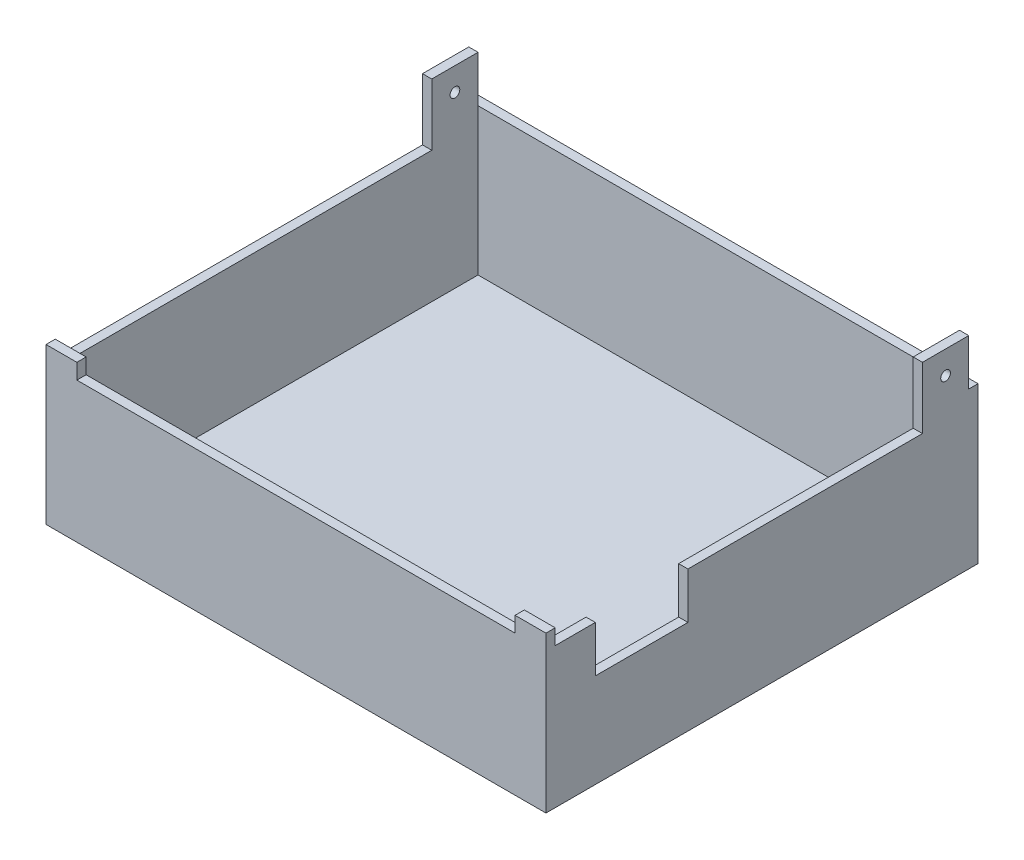
ISO-10303-21;
HEADER;
FILE_DESCRIPTION(('STEP AP214'),'2;1');
FILE_NAME('part.step','',(''),(''),'','','');
FILE_SCHEMA(('AUTOMOTIVE_DESIGN { 1 0 10303 214 1 1 1 1 }'));
ENDSEC;
DATA;
#1=APPLICATION_CONTEXT('core data for automotive mechanical design processes');
#2=APPLICATION_PROTOCOL_DEFINITION('international standard','automotive_design',2000,#1);
#3=PRODUCT_CONTEXT('',#1,'mechanical');
#4=PRODUCT('Part','Part','',(#3));
#5=PRODUCT_RELATED_PRODUCT_CATEGORY('part','',(#4));
#6=PRODUCT_DEFINITION_FORMATION('','',#4);
#7=PRODUCT_DEFINITION_CONTEXT('part definition',#1,'design');
#8=PRODUCT_DEFINITION('design','',#6,#7);
#9=PRODUCT_DEFINITION_SHAPE('','',#8);
#10=(LENGTH_UNIT() NAMED_UNIT(*) SI_UNIT(.MILLI.,.METRE.));
#11=(NAMED_UNIT(*) PLANE_ANGLE_UNIT() SI_UNIT($,.RADIAN.));
#12=(NAMED_UNIT(*) SI_UNIT($,.STERADIAN.) SOLID_ANGLE_UNIT());
#13=UNCERTAINTY_MEASURE_WITH_UNIT(LENGTH_MEASURE(1.E-05),#10,'distance_accuracy_value','');
#14=(GEOMETRIC_REPRESENTATION_CONTEXT(3) GLOBAL_UNCERTAINTY_ASSIGNED_CONTEXT((#13)) GLOBAL_UNIT_ASSIGNED_CONTEXT((#10,
#11,#12)) REPRESENTATION_CONTEXT('',''));
#15=CARTESIAN_POINT('',(0.,0.,0.));
#16=DIRECTION('',(0.,0.,1.));
#17=DIRECTION('',(1.,0.,0.));
#18=AXIS2_PLACEMENT_3D('',#15,#16,#17);
#19=CARTESIAN_POINT('',(-81.,45.5,-52.));
#20=DIRECTION('',(0.,-1.,0.));
#21=DIRECTION('',(0.,0.,-1.));
#22=AXIS2_PLACEMENT_3D('',#19,#20,#21);
#23=PLANE('',#22);
#24=DIRECTION('',(0.,0.,-1.));
#25=VECTOR('',#24,1.);
#26=CARTESIAN_POINT('',(81.,45.5,-52.));
#27=LINE('',#26,#25);
#28=CARTESIAN_POINT('',(81.,45.5,67.));
#29=VERTEX_POINT('',#28);
#30=CARTESIAN_POINT('',(81.,45.5,54.));
#31=VERTEX_POINT('',#30);
#32=EDGE_CURVE('E291',#29,#31,#27,.T.);
#33=ORIENTED_EDGE('',*,*,#32,.T.);
#34=DIRECTION('',(1.,0.,0.));
#35=VECTOR('',#34,1.);
#36=CARTESIAN_POINT('',(-81.001,45.5,54.));
#37=LINE('',#36,#35);
#38=CARTESIAN_POINT('',(78.,45.5,54.));
#39=VERTEX_POINT('',#38);
#40=EDGE_CURVE('E216',#39,#31,#37,.T.);
#41=ORIENTED_EDGE('',*,*,#40,.F.);
#42=DIRECTION('',(0.,0.,1.));
#43=VECTOR('',#42,1.);
#44=CARTESIAN_POINT('',(78.,45.5,-67.));
#45=LINE('',#44,#43);
#46=CARTESIAN_POINT('',(78.,45.5,67.));
#47=VERTEX_POINT('',#46);
#48=EDGE_CURVE('E339',#39,#47,#45,.T.);
#49=ORIENTED_EDGE('',*,*,#48,.T.);
#50=DIRECTION('',(1.,0.,0.));
#51=VECTOR('',#50,1.);
#52=CARTESIAN_POINT('',(-81.,45.5,67.));
#53=LINE('',#52,#51);
#54=EDGE_CURVE('E321',#47,#29,#53,.T.);
#55=ORIENTED_EDGE('',*,*,#54,.T.);
#56=EDGE_LOOP('',(#33,#41,#49,#55));
#57=FACE_BOUND('',#56,.T.);
#58=ADVANCED_FACE('F39',(#57),#23,.F.);
#59=CARTESIAN_POINT('',(0.,50.5,0.));
#60=DIRECTION('',(0.,1.,0.));
#61=DIRECTION('',(0.,0.,1.));
#62=AXIS2_PLACEMENT_3D('',#59,#60,#61);
#63=PLANE('',#62);
#64=DIRECTION('',(0.,0.,1.));
#65=VECTOR('',#64,1.);
#66=CARTESIAN_POINT('',(71.,50.5,-70.0010000000001));
#67=LINE('',#66,#65);
#68=CARTESIAN_POINT('',(71.,50.5,67.));
#69=VERTEX_POINT('',#68);
#70=CARTESIAN_POINT('',(71.,50.5,70.));
#71=VERTEX_POINT('',#70);
#72=EDGE_CURVE('E273',#69,#71,#67,.T.);
#73=ORIENTED_EDGE('',*,*,#72,.T.);
#74=DIRECTION('',(1.,0.,0.));
#75=VECTOR('',#74,1.);
#76=CARTESIAN_POINT('',(-80.9999999999999,50.5,70.));
#77=LINE('',#76,#75);
#78=CARTESIAN_POINT('',(81.,50.5,70.));
#79=VERTEX_POINT('',#78);
#80=EDGE_CURVE('E440',#71,#79,#77,.T.);
#81=ORIENTED_EDGE('',*,*,#80,.T.);
#82=DIRECTION('',(0.,0.,-1.));
#83=VECTOR('',#82,1.);
#84=CARTESIAN_POINT('',(81.,50.5,-70.0000000000001));
#85=LINE('',#84,#83);
#86=CARTESIAN_POINT('',(81.,50.5,67.));
#87=VERTEX_POINT('',#86);
#88=EDGE_CURVE('E428',#79,#87,#85,.T.);
#89=ORIENTED_EDGE('',*,*,#88,.T.);
#90=DIRECTION('',(1.,0.,0.));
#91=VECTOR('',#90,1.);
#92=CARTESIAN_POINT('',(-78.,50.5,67.));
#93=LINE('',#92,#91);
#94=EDGE_CURVE('E394',#69,#87,#93,.T.);
#95=ORIENTED_EDGE('',*,*,#94,.F.);
#96=EDGE_LOOP('',(#73,#81,#89,#95));
#97=FACE_BOUND('',#96,.T.);
#98=ADVANCED_FACE('F561',(#97),#63,.T.);
#99=DIRECTION('',(0.,0.,1.));
#100=VECTOR('',#99,1.);
#101=CARTESIAN_POINT('',(-71.,50.5,-70.0010000000001));
#102=LINE('',#101,#100);
#103=CARTESIAN_POINT('',(-71.,50.5,67.));
#104=VERTEX_POINT('',#103);
#105=CARTESIAN_POINT('',(-71.,50.5,70.));
#106=VERTEX_POINT('',#105);
#107=EDGE_CURVE('E269',#104,#106,#102,.T.);
#108=ORIENTED_EDGE('',*,*,#107,.F.);
#109=CARTESIAN_POINT('',(-81.,50.5,67.));
#110=VERTEX_POINT('',#109);
#111=EDGE_CURVE('E396',#110,#104,#93,.T.);
#112=ORIENTED_EDGE('',*,*,#111,.F.);
#113=DIRECTION('',(0.,0.,1.));
#114=VECTOR('',#113,1.);
#115=CARTESIAN_POINT('',(-80.9999999999999,50.5,-70.0000000000001));
#116=LINE('',#115,#114);
#117=CARTESIAN_POINT('',(-80.9999999999999,50.5,70.));
#118=VERTEX_POINT('',#117);
#119=EDGE_CURVE('E436',#110,#118,#116,.T.);
#120=ORIENTED_EDGE('',*,*,#119,.T.);
#121=EDGE_CURVE('E441',#118,#106,#77,.T.);
#122=ORIENTED_EDGE('',*,*,#121,.T.);
#123=EDGE_LOOP('',(#108,#112,#120,#122));
#124=FACE_BOUND('',#123,.T.);
#125=ADVANCED_FACE('F568',(#124),#63,.T.);
#126=DIRECTION('',(-1.,0.,0.));
#127=VECTOR('',#126,1.);
#128=CARTESIAN_POINT('',(-78.,50.5,-67.));
#129=LINE('',#128,#127);
#130=CARTESIAN_POINT('',(78.,50.5,-67.));
#131=VERTEX_POINT('',#130);
#132=CARTESIAN_POINT('',(-78.,50.5,-67.));
#133=VERTEX_POINT('',#132);
#134=EDGE_CURVE('E390',#131,#133,#129,.T.);
#135=ORIENTED_EDGE('',*,*,#134,.F.);
#136=DIRECTION('',(-1.,0.,0.));
#137=VECTOR('',#136,1.);
#138=CARTESIAN_POINT('',(78.,50.5,-67.));
#139=LINE('',#138,#137);
#140=CARTESIAN_POINT('',(81.,50.5,-67.));
#141=VERTEX_POINT('',#140);
#142=EDGE_CURVE('E347',#141,#131,#139,.T.);
#143=ORIENTED_EDGE('',*,*,#142,.F.);
#144=CARTESIAN_POINT('',(81.,50.5,-70.0000000000001));
#145=VERTEX_POINT('',#144);
#146=EDGE_CURVE('E427',#141,#145,#85,.T.);
#147=ORIENTED_EDGE('',*,*,#146,.T.);
#148=DIRECTION('',(-1.,0.,0.));
#149=VECTOR('',#148,1.);
#150=CARTESIAN_POINT('',(-80.9999999999999,50.5,-70.0000000000001));
#151=LINE('',#150,#149);
#152=CARTESIAN_POINT('',(-80.9999999999999,50.5,-70.0000000000001));
#153=VERTEX_POINT('',#152);
#154=EDGE_CURVE('E432',#145,#153,#151,.T.);
#155=ORIENTED_EDGE('',*,*,#154,.T.);
#156=CARTESIAN_POINT('',(-80.9999999999999,50.5,-67.));
#157=VERTEX_POINT('',#156);
#158=EDGE_CURVE('E437',#153,#157,#116,.T.);
#159=ORIENTED_EDGE('',*,*,#158,.T.);
#160=DIRECTION('',(-1.,0.,0.));
#161=VECTOR('',#160,1.);
#162=CARTESIAN_POINT('',(-78.,50.5,-67.));
#163=LINE('',#162,#161);
#164=EDGE_CURVE('E367',#133,#157,#163,.T.);
#165=ORIENTED_EDGE('',*,*,#164,.F.);
#166=EDGE_LOOP('',(#135,#143,#147,#155,#159,#165));
#167=FACE_BOUND('',#166,.T.);
#168=ADVANCED_FACE('F497',(#167),#63,.T.);
#169=CARTESIAN_POINT('',(-81.,3.,-70.));
#170=DIRECTION('',(1.,0.,0.));
#171=DIRECTION('',(0.,0.,-1.));
#172=AXIS2_PLACEMENT_3D('',#169,#170,#171);
#173=PLANE('',#172);
#174=CARTESIAN_POINT('',(-81.,58.,-59.5));
#175=DIRECTION('',(1.,0.,0.));
#176=DIRECTION('',(0.,0.,-1.));
#177=AXIS2_PLACEMENT_3D('',#174,#175,#176);
#178=CIRCLE('',#177,1.575);
#179=CARTESIAN_POINT('',(-81.,58.,-61.075));
#180=VERTEX_POINT('',#179);
#181=EDGE_CURVE('E304',#180,#180,#178,.T.);
#182=ORIENTED_EDGE('',*,*,#181,.T.);
#183=EDGE_LOOP('',(#182));
#184=FACE_BOUND('',#183,.T.);
#185=DIRECTION('',(0.,0.,-1.));
#186=VECTOR('',#185,1.);
#187=CARTESIAN_POINT('',(-81.,45.5,-52.));
#188=LINE('',#187,#186);
#189=CARTESIAN_POINT('',(-81.,45.5,67.));
#190=VERTEX_POINT('',#189);
#191=CARTESIAN_POINT('',(-81.,45.5,-52.));
#192=VERTEX_POINT('',#191);
#193=EDGE_CURVE('E295',#190,#192,#188,.T.);
#194=ORIENTED_EDGE('',*,*,#193,.T.);
#195=DIRECTION('',(0.,1.,0.));
#196=VECTOR('',#195,1.);
#197=CARTESIAN_POINT('',(-81.,65.5,-52.));
#198=LINE('',#197,#196);
#199=CARTESIAN_POINT('',(-81.,65.5,-52.));
#200=VERTEX_POINT('',#199);
#201=EDGE_CURVE('E286',#192,#200,#198,.T.);
#202=ORIENTED_EDGE('',*,*,#201,.T.);
#203=DIRECTION('',(0.,0.,1.));
#204=VECTOR('',#203,1.);
#205=CARTESIAN_POINT('',(-80.9999999999999,65.5,-67.));
#206=LINE('',#205,#204);
#207=CARTESIAN_POINT('',(-80.9999999999999,65.5,-67.));
#208=VERTEX_POINT('',#207);
#209=EDGE_CURVE('E374',#208,#200,#206,.T.);
#210=ORIENTED_EDGE('',*,*,#209,.F.);
#211=DIRECTION('',(0.,-1.,0.));
#212=VECTOR('',#211,1.);
#213=CARTESIAN_POINT('',(-80.9999999999999,65.5,-67.));
#214=LINE('',#213,#212);
#215=EDGE_CURVE('E378',#208,#157,#214,.T.);
#216=ORIENTED_EDGE('',*,*,#215,.T.);
#217=ORIENTED_EDGE('',*,*,#158,.F.);
#218=DIRECTION('',(0.,-1.,0.));
#219=VECTOR('',#218,1.);
#220=CARTESIAN_POINT('',(-81.,3.,-70.));
#221=LINE('',#220,#219);
#222=CARTESIAN_POINT('',(-81.,0.,-70.));
#223=VERTEX_POINT('',#222);
#224=EDGE_CURVE('E458',#153,#223,#221,.T.);
#225=ORIENTED_EDGE('',*,*,#224,.T.);
#226=DIRECTION('',(0.,0.,1.));
#227=VECTOR('',#226,1.);
#228=CARTESIAN_POINT('',(-81.,0.,-70.));
#229=LINE('',#228,#227);
#230=CARTESIAN_POINT('',(-81.,0.,70.));
#231=VERTEX_POINT('',#230);
#232=EDGE_CURVE('E445',#223,#231,#229,.T.);
#233=ORIENTED_EDGE('',*,*,#232,.T.);
#234=DIRECTION('',(0.,-1.,0.));
#235=VECTOR('',#234,1.);
#236=CARTESIAN_POINT('',(-81.,3.,70.));
#237=LINE('',#236,#235);
#238=EDGE_CURVE('E49',#118,#231,#237,.T.);
#239=ORIENTED_EDGE('',*,*,#238,.F.);
#240=ORIENTED_EDGE('',*,*,#119,.F.);
#241=DIRECTION('',(0.,-1.,0.));
#242=VECTOR('',#241,1.);
#243=CARTESIAN_POINT('',(-81.,65.5,67.));
#244=LINE('',#243,#242);
#245=EDGE_CURVE('E290',#110,#190,#244,.T.);
#246=ORIENTED_EDGE('',*,*,#245,.T.);
#247=EDGE_LOOP('',(#194,#202,#210,#216,#217,#225,#233,#239,#240,#246));
#248=FACE_BOUND('',#247,.T.);
#249=ADVANCED_FACE('F41',(#184,#248),#173,.F.);
#250=CARTESIAN_POINT('',(81.,3.,70.));
#251=DIRECTION('',(0.,0.,-1.));
#252=DIRECTION('',(-1.,0.,0.));
#253=AXIS2_PLACEMENT_3D('',#250,#251,#252);
#254=PLANE('',#253);
#255=ORIENTED_EDGE('',*,*,#80,.F.);
#256=DIRECTION('',(0.,1.,0.));
#257=VECTOR('',#256,1.);
#258=CARTESIAN_POINT('',(71.,50.5,70.));
#259=LINE('',#258,#257);
#260=CARTESIAN_POINT('',(71.,45.5,70.));
#261=VERTEX_POINT('',#260);
#262=EDGE_CURVE('E266',#261,#71,#259,.T.);
#263=ORIENTED_EDGE('',*,*,#262,.F.);
#264=DIRECTION('',(1.,0.,0.));
#265=VECTOR('',#264,1.);
#266=CARTESIAN_POINT('',(-71.,45.5,70.));
#267=LINE('',#266,#265);
#268=CARTESIAN_POINT('',(-71.,45.5,70.));
#269=VERTEX_POINT('',#268);
#270=EDGE_CURVE('E262',#269,#261,#267,.T.);
#271=ORIENTED_EDGE('',*,*,#270,.F.);
#272=DIRECTION('',(0.,-1.,0.));
#273=VECTOR('',#272,1.);
#274=CARTESIAN_POINT('',(-71.,50.5,70.));
#275=LINE('',#274,#273);
#276=EDGE_CURVE('E259',#106,#269,#275,.T.);
#277=ORIENTED_EDGE('',*,*,#276,.F.);
#278=ORIENTED_EDGE('',*,*,#121,.F.);
#279=ORIENTED_EDGE('',*,*,#238,.T.);
#280=DIRECTION('',(1.,0.,0.));
#281=VECTOR('',#280,1.);
#282=CARTESIAN_POINT('',(81.,0.,70.));
#283=LINE('',#282,#281);
#284=CARTESIAN_POINT('',(81.,0.,70.));
#285=VERTEX_POINT('',#284);
#286=EDGE_CURVE('E449',#231,#285,#283,.T.);
#287=ORIENTED_EDGE('',*,*,#286,.T.);
#288=DIRECTION('',(0.,-1.,0.));
#289=VECTOR('',#288,1.);
#290=CARTESIAN_POINT('',(81.,3.,70.));
#291=LINE('',#290,#289);
#292=EDGE_CURVE('E466',#79,#285,#291,.T.);
#293=ORIENTED_EDGE('',*,*,#292,.F.);
#294=EDGE_LOOP('',(#255,#263,#271,#277,#278,#279,#287,#293));
#295=FACE_BOUND('',#294,.T.);
#296=ADVANCED_FACE('F476',(#295),#254,.F.);
#297=CARTESIAN_POINT('',(81.,3.,-70.));
#298=DIRECTION('',(-1.,0.,0.));
#299=DIRECTION('',(0.,0.,1.));
#300=AXIS2_PLACEMENT_3D('',#297,#298,#299);
#301=PLANE('',#300);
#302=CARTESIAN_POINT('',(81.,58.,-59.5));
#303=DIRECTION('',(1.,0.,0.));
#304=DIRECTION('',(0.,0.,-1.));
#305=AXIS2_PLACEMENT_3D('',#302,#303,#304);
#306=CIRCLE('',#305,1.575);
#307=CARTESIAN_POINT('',(81.,58.,-61.075));
#308=VERTEX_POINT('',#307);
#309=EDGE_CURVE('E285',#308,#308,#306,.T.);
#310=ORIENTED_EDGE('',*,*,#309,.F.);
#311=EDGE_LOOP('',(#310));
#312=FACE_BOUND('',#311,.T.);
#313=DIRECTION('',(0.,0.,-1.));
#314=VECTOR('',#313,1.);
#315=CARTESIAN_POINT('',(81.,30.5,54.));
#316=LINE('',#315,#314);
#317=CARTESIAN_POINT('',(81.,30.5,54.));
#318=VERTEX_POINT('',#317);
#319=CARTESIAN_POINT('',(81.,30.5,24.));
#320=VERTEX_POINT('',#319);
#321=EDGE_CURVE('E223',#318,#320,#316,.T.);
#322=ORIENTED_EDGE('',*,*,#321,.F.);
#323=DIRECTION('',(0.,-1.,0.));
#324=VECTOR('',#323,1.);
#325=CARTESIAN_POINT('',(81.,45.5,54.));
#326=LINE('',#325,#324);
#327=EDGE_CURVE('E225',#31,#318,#326,.T.);
#328=ORIENTED_EDGE('',*,*,#327,.F.);
#329=ORIENTED_EDGE('',*,*,#32,.F.);
#330=DIRECTION('',(0.,-1.,0.));
#331=VECTOR('',#330,1.);
#332=CARTESIAN_POINT('',(81.,65.5,67.));
#333=LINE('',#332,#331);
#334=EDGE_CURVE('E303',#87,#29,#333,.T.);
#335=ORIENTED_EDGE('',*,*,#334,.F.);
#336=ORIENTED_EDGE('',*,*,#88,.F.);
#337=ORIENTED_EDGE('',*,*,#292,.T.);
#338=DIRECTION('',(0.,0.,-1.));
#339=VECTOR('',#338,1.);
#340=CARTESIAN_POINT('',(81.,0.,-70.));
#341=LINE('',#340,#339);
#342=CARTESIAN_POINT('',(81.,0.,-70.));
#343=VERTEX_POINT('',#342);
#344=EDGE_CURVE('E452',#285,#343,#341,.T.);
#345=ORIENTED_EDGE('',*,*,#344,.T.);
#346=DIRECTION('',(0.,-1.,0.));
#347=VECTOR('',#346,1.);
#348=CARTESIAN_POINT('',(81.,3.,-70.));
#349=LINE('',#348,#347);
#350=EDGE_CURVE('E462',#145,#343,#349,.T.);
#351=ORIENTED_EDGE('',*,*,#350,.F.);
#352=ORIENTED_EDGE('',*,*,#146,.F.);
#353=DIRECTION('',(0.,-1.,0.));
#354=VECTOR('',#353,1.);
#355=CARTESIAN_POINT('',(81.,65.5,-67.));
#356=LINE('',#355,#354);
#357=CARTESIAN_POINT('',(81.,65.5,-67.));
#358=VERTEX_POINT('',#357);
#359=EDGE_CURVE('E364',#358,#141,#356,.T.);
#360=ORIENTED_EDGE('',*,*,#359,.F.);
#361=DIRECTION('',(0.,0.,-1.));
#362=VECTOR('',#361,1.);
#363=CARTESIAN_POINT('',(81.,65.5,-67.));
#364=LINE('',#363,#362);
#365=CARTESIAN_POINT('',(81.,65.5,-52.));
#366=VERTEX_POINT('',#365);
#367=EDGE_CURVE('E352',#366,#358,#364,.T.);
#368=ORIENTED_EDGE('',*,*,#367,.F.);
#369=DIRECTION('',(0.,1.,0.));
#370=VECTOR('',#369,1.);
#371=CARTESIAN_POINT('',(81.,65.5,-52.));
#372=LINE('',#371,#370);
#373=CARTESIAN_POINT('',(81.,45.5,-52.));
#374=VERTEX_POINT('',#373);
#375=EDGE_CURVE('E300',#374,#366,#372,.T.);
#376=ORIENTED_EDGE('',*,*,#375,.F.);
#377=CARTESIAN_POINT('',(81.,45.5,24.));
#378=VERTEX_POINT('',#377);
#379=EDGE_CURVE('E308',#378,#374,#27,.T.);
#380=ORIENTED_EDGE('',*,*,#379,.F.);
#381=DIRECTION('',(0.,1.,0.));
#382=VECTOR('',#381,1.);
#383=CARTESIAN_POINT('',(81.,45.5,24.));
#384=LINE('',#383,#382);
#385=EDGE_CURVE('E56',#320,#378,#384,.T.);
#386=ORIENTED_EDGE('',*,*,#385,.F.);
#387=EDGE_LOOP('',(#322,#328,#329,#335,#336,#337,#345,#351,#352,#360,#368,#376,#380,#386));
#388=FACE_BOUND('',#387,.T.);
#389=ADVANCED_FACE('F489',(#312,#388),#301,.F.);
#390=CARTESIAN_POINT('',(81.,3.,-70.));
#391=DIRECTION('',(0.,0.,1.));
#392=DIRECTION('',(1.,0.,0.));
#393=AXIS2_PLACEMENT_3D('',#390,#391,#392);
#394=PLANE('',#393);
#395=DIRECTION('',(-1.,0.,0.));
#396=VECTOR('',#395,1.);
#397=CARTESIAN_POINT('',(81.,0.,-70.));
#398=LINE('',#397,#396);
#399=EDGE_CURVE('E455',#343,#223,#398,.T.);
#400=ORIENTED_EDGE('',*,*,#399,.T.);
#401=ORIENTED_EDGE('',*,*,#224,.F.);
#402=ORIENTED_EDGE('',*,*,#154,.F.);
#403=ORIENTED_EDGE('',*,*,#350,.T.);
#404=EDGE_LOOP('',(#400,#401,#402,#403));
#405=FACE_BOUND('',#404,.T.);
#406=ADVANCED_FACE('F494',(#405),#394,.F.);
#407=CARTESIAN_POINT('',(0.,0.,0.));
#408=DIRECTION('',(0.,-1.,0.));
#409=DIRECTION('',(0.,0.,-1.));
#410=AXIS2_PLACEMENT_3D('',#407,#408,#409);
#411=PLANE('',#410);
#412=ORIENTED_EDGE('',*,*,#232,.F.);
#413=ORIENTED_EDGE('',*,*,#399,.F.);
#414=ORIENTED_EDGE('',*,*,#344,.F.);
#415=ORIENTED_EDGE('',*,*,#286,.F.);
#416=EDGE_LOOP('',(#412,#413,#414,#415));
#417=FACE_BOUND('',#416,.T.);
#418=ADVANCED_FACE('F485',(#417),#411,.T.);
#419=CARTESIAN_POINT('',(78.,50.5,-67.));
#420=DIRECTION('',(-1.,0.,0.));
#421=DIRECTION('',(0.,0.,1.));
#422=AXIS2_PLACEMENT_3D('',#419,#420,#421);
#423=PLANE('',#422);
#424=DIRECTION('',(0.,-1.,0.));
#425=VECTOR('',#424,1.);
#426=CARTESIAN_POINT('',(78.,45.5,54.));
#427=LINE('',#426,#425);
#428=CARTESIAN_POINT('',(78.,30.5,54.));
#429=VERTEX_POINT('',#428);
#430=EDGE_CURVE('E231',#39,#429,#427,.T.);
#431=ORIENTED_EDGE('',*,*,#430,.T.);
#432=DIRECTION('',(0.,0.,-1.));
#433=VECTOR('',#432,1.);
#434=CARTESIAN_POINT('',(78.,30.5,54.));
#435=LINE('',#434,#433);
#436=CARTESIAN_POINT('',(78.,30.5,24.));
#437=VERTEX_POINT('',#436);
#438=EDGE_CURVE('E220',#429,#437,#435,.T.);
#439=ORIENTED_EDGE('',*,*,#438,.T.);
#440=DIRECTION('',(0.,1.,0.));
#441=VECTOR('',#440,1.);
#442=CARTESIAN_POINT('',(78.,45.5,24.));
#443=LINE('',#442,#441);
#444=CARTESIAN_POINT('',(78.,45.5,24.));
#445=VERTEX_POINT('',#444);
#446=EDGE_CURVE('E205',#437,#445,#443,.T.);
#447=ORIENTED_EDGE('',*,*,#446,.T.);
#448=CARTESIAN_POINT('',(78.,45.5,-52.));
#449=VERTEX_POINT('',#448);
#450=EDGE_CURVE('E340',#449,#445,#45,.T.);
#451=ORIENTED_EDGE('',*,*,#450,.F.);
#452=DIRECTION('',(0.,-1.,0.));
#453=VECTOR('',#452,1.);
#454=CARTESIAN_POINT('',(78.,50.5,-52.));
#455=LINE('',#454,#453);
#456=CARTESIAN_POINT('',(78.,65.5,-52.));
#457=VERTEX_POINT('',#456);
#458=EDGE_CURVE('E333',#457,#449,#455,.T.);
#459=ORIENTED_EDGE('',*,*,#458,.F.);
#460=DIRECTION('',(0.,0.,1.));
#461=VECTOR('',#460,1.);
#462=CARTESIAN_POINT('',(78.,65.5,-67.));
#463=LINE('',#462,#461);
#464=CARTESIAN_POINT('',(78.,65.5,-67.));
#465=VERTEX_POINT('',#464);
#466=EDGE_CURVE('E348',#465,#457,#463,.T.);
#467=ORIENTED_EDGE('',*,*,#466,.F.);
#468=DIRECTION('',(0.,-1.,0.));
#469=VECTOR('',#468,1.);
#470=CARTESIAN_POINT('',(78.,65.5,-67.));
#471=LINE('',#470,#469);
#472=EDGE_CURVE('E358',#465,#131,#471,.T.);
#473=ORIENTED_EDGE('',*,*,#472,.T.);
#474=DIRECTION('',(0.,-1.,0.));
#475=VECTOR('',#474,1.);
#476=CARTESIAN_POINT('',(78.,50.5,-67.));
#477=LINE('',#476,#475);
#478=CARTESIAN_POINT('',(78.,3.,-67.));
#479=VERTEX_POINT('',#478);
#480=EDGE_CURVE('E423',#131,#479,#477,.T.);
#481=ORIENTED_EDGE('',*,*,#480,.T.);
#482=DIRECTION('',(0.,0.,-1.));
#483=VECTOR('',#482,1.);
#484=CARTESIAN_POINT('',(78.,3.,-67.));
#485=LINE('',#484,#483);
#486=CARTESIAN_POINT('',(78.,3.,67.));
#487=VERTEX_POINT('',#486);
#488=EDGE_CURVE('E389',#487,#479,#485,.T.);
#489=ORIENTED_EDGE('',*,*,#488,.F.);
#490=DIRECTION('',(0.,-1.,0.));
#491=VECTOR('',#490,1.);
#492=CARTESIAN_POINT('',(78.,50.5,67.));
#493=LINE('',#492,#491);
#494=EDGE_CURVE('E400',#47,#487,#493,.T.);
#495=ORIENTED_EDGE('',*,*,#494,.F.);
#496=ORIENTED_EDGE('',*,*,#48,.F.);
#497=EDGE_LOOP('',(#431,#439,#447,#451,#459,#467,#473,#481,#489,#495,#496));
#498=FACE_BOUND('',#497,.T.);
#499=CARTESIAN_POINT('',(78.,58.,-59.5));
#500=DIRECTION('',(-1.,0.,0.));
#501=DIRECTION('',(0.,0.,1.));
#502=AXIS2_PLACEMENT_3D('',#499,#500,#501);
#503=CIRCLE('',#502,1.575);
#504=CARTESIAN_POINT('',(78.,58.,-57.925));
#505=VERTEX_POINT('',#504);
#506=EDGE_CURVE('E343',#505,#505,#503,.T.);
#507=ORIENTED_EDGE('',*,*,#506,.F.);
#508=EDGE_LOOP('',(#507));
#509=FACE_BOUND('',#508,.T.);
#510=ADVANCED_FACE('F228',(#498,#509),#423,.T.);
#511=CARTESIAN_POINT('',(-78.,50.5,-67.));
#512=DIRECTION('',(0.,0.,1.));
#513=DIRECTION('',(1.,0.,0.));
#514=AXIS2_PLACEMENT_3D('',#511,#512,#513);
#515=PLANE('',#514);
#516=DIRECTION('',(-1.,0.,0.));
#517=VECTOR('',#516,1.);
#518=CARTESIAN_POINT('',(-78.,3.,-67.));
#519=LINE('',#518,#517);
#520=CARTESIAN_POINT('',(-78.,3.,-67.));
#521=VERTEX_POINT('',#520);
#522=EDGE_CURVE('E404',#479,#521,#519,.T.);
#523=ORIENTED_EDGE('',*,*,#522,.F.);
#524=ORIENTED_EDGE('',*,*,#480,.F.);
#525=ORIENTED_EDGE('',*,*,#134,.T.);
#526=DIRECTION('',(0.,-1.,0.));
#527=VECTOR('',#526,1.);
#528=CARTESIAN_POINT('',(-78.,50.5,-67.));
#529=LINE('',#528,#527);
#530=EDGE_CURVE('E420',#133,#521,#529,.T.);
#531=ORIENTED_EDGE('',*,*,#530,.T.);
#532=EDGE_LOOP('',(#523,#524,#525,#531));
#533=FACE_BOUND('',#532,.T.);
#534=ADVANCED_FACE('F508',(#533),#515,.T.);
#535=CARTESIAN_POINT('',(-78.,50.5,-67.));
#536=DIRECTION('',(1.,0.,0.));
#537=DIRECTION('',(0.,0.,-1.));
#538=AXIS2_PLACEMENT_3D('',#535,#536,#537);
#539=PLANE('',#538);
#540=DIRECTION('',(0.,1.,0.));
#541=VECTOR('',#540,1.);
#542=CARTESIAN_POINT('',(-78.,50.5,-52.));
#543=LINE('',#542,#541);
#544=CARTESIAN_POINT('',(-78.,45.5,-52.));
#545=VERTEX_POINT('',#544);
#546=CARTESIAN_POINT('',(-78.,65.5,-52.));
#547=VERTEX_POINT('',#546);
#548=EDGE_CURVE('E316',#545,#547,#543,.T.);
#549=ORIENTED_EDGE('',*,*,#548,.F.);
#550=DIRECTION('',(0.,0.,-1.));
#551=VECTOR('',#550,1.);
#552=CARTESIAN_POINT('',(-78.,45.5,-67.));
#553=LINE('',#552,#551);
#554=CARTESIAN_POINT('',(-78.,45.5,67.));
#555=VERTEX_POINT('',#554);
#556=EDGE_CURVE('E336',#555,#545,#553,.T.);
#557=ORIENTED_EDGE('',*,*,#556,.F.);
#558=DIRECTION('',(0.,-1.,0.));
#559=VECTOR('',#558,1.);
#560=CARTESIAN_POINT('',(-78.,50.5,67.));
#561=LINE('',#560,#559);
#562=CARTESIAN_POINT('',(-78.,3.,67.));
#563=VERTEX_POINT('',#562);
#564=EDGE_CURVE('E417',#555,#563,#561,.T.);
#565=ORIENTED_EDGE('',*,*,#564,.T.);
#566=DIRECTION('',(0.,0.,1.));
#567=VECTOR('',#566,1.);
#568=CARTESIAN_POINT('',(-78.,3.,-67.));
#569=LINE('',#568,#567);
#570=EDGE_CURVE('E408',#521,#563,#569,.T.);
#571=ORIENTED_EDGE('',*,*,#570,.F.);
#572=ORIENTED_EDGE('',*,*,#530,.F.);
#573=DIRECTION('',(0.,-1.,0.));
#574=VECTOR('',#573,1.);
#575=CARTESIAN_POINT('',(-78.,65.5,-67.));
#576=LINE('',#575,#574);
#577=CARTESIAN_POINT('',(-78.,65.5,-67.));
#578=VERTEX_POINT('',#577);
#579=EDGE_CURVE('E385',#578,#133,#576,.T.);
#580=ORIENTED_EDGE('',*,*,#579,.F.);
#581=DIRECTION('',(0.,0.,-1.));
#582=VECTOR('',#581,1.);
#583=CARTESIAN_POINT('',(-78.,65.5,-67.));
#584=LINE('',#583,#582);
#585=EDGE_CURVE('E368',#547,#578,#584,.T.);
#586=ORIENTED_EDGE('',*,*,#585,.F.);
#587=EDGE_LOOP('',(#549,#557,#565,#571,#572,#580,#586));
#588=FACE_BOUND('',#587,.T.);
#589=CARTESIAN_POINT('',(-78.,58.,-59.5));
#590=DIRECTION('',(1.,0.,0.));
#591=DIRECTION('',(0.,0.,-1.));
#592=AXIS2_PLACEMENT_3D('',#589,#590,#591);
#593=CIRCLE('',#592,1.575);
#594=CARTESIAN_POINT('',(-78.,58.,-61.075));
#595=VERTEX_POINT('',#594);
#596=EDGE_CURVE('E43',#595,#595,#593,.T.);
#597=ORIENTED_EDGE('',*,*,#596,.F.);
#598=EDGE_LOOP('',(#597));
#599=FACE_BOUND('',#598,.T.);
#600=ADVANCED_FACE('F512',(#588,#599),#539,.T.);
#601=CARTESIAN_POINT('',(-78.,50.5,67.));
#602=DIRECTION('',(0.,0.,-1.));
#603=DIRECTION('',(-1.,0.,0.));
#604=AXIS2_PLACEMENT_3D('',#601,#602,#603);
#605=PLANE('',#604);
#606=DIRECTION('',(0.,1.,0.));
#607=VECTOR('',#606,1.);
#608=CARTESIAN_POINT('',(71.,50.5,67.));
#609=LINE('',#608,#607);
#610=CARTESIAN_POINT('',(71.,45.5,67.));
#611=VERTEX_POINT('',#610);
#612=EDGE_CURVE('E239',#611,#69,#609,.T.);
#613=ORIENTED_EDGE('',*,*,#612,.T.);
#614=ORIENTED_EDGE('',*,*,#94,.T.);
#615=ORIENTED_EDGE('',*,*,#334,.T.);
#616=ORIENTED_EDGE('',*,*,#54,.F.);
#617=ORIENTED_EDGE('',*,*,#494,.T.);
#618=DIRECTION('',(1.,0.,0.));
#619=VECTOR('',#618,1.);
#620=CARTESIAN_POINT('',(-78.,3.,67.));
#621=LINE('',#620,#619);
#622=EDGE_CURVE('E395',#563,#487,#621,.T.);
#623=ORIENTED_EDGE('',*,*,#622,.F.);
#624=ORIENTED_EDGE('',*,*,#564,.F.);
#625=EDGE_CURVE('E318',#190,#555,#53,.T.);
#626=ORIENTED_EDGE('',*,*,#625,.F.);
#627=ORIENTED_EDGE('',*,*,#245,.F.);
#628=ORIENTED_EDGE('',*,*,#111,.T.);
#629=DIRECTION('',(0.,-1.,0.));
#630=VECTOR('',#629,1.);
#631=CARTESIAN_POINT('',(-71.,50.5,67.));
#632=LINE('',#631,#630);
#633=CARTESIAN_POINT('',(-71.,45.5,67.));
#634=VERTEX_POINT('',#633);
#635=EDGE_CURVE('E255',#104,#634,#632,.T.);
#636=ORIENTED_EDGE('',*,*,#635,.T.);
#637=DIRECTION('',(1.,0.,0.));
#638=VECTOR('',#637,1.);
#639=CARTESIAN_POINT('',(-71.,45.5,67.));
#640=LINE('',#639,#638);
#641=EDGE_CURVE('E272',#634,#611,#640,.T.);
#642=ORIENTED_EDGE('',*,*,#641,.T.);
#643=EDGE_LOOP('',(#613,#614,#615,#616,#617,#623,#624,#626,#627,#628,#636,#642));
#644=FACE_BOUND('',#643,.T.);
#645=ADVANCED_FACE('F588',(#644),#605,.T.);
#646=CARTESIAN_POINT('',(0.,3.,0.));
#647=DIRECTION('',(0.,-1.,0.));
#648=DIRECTION('',(0.,0.,-1.));
#649=AXIS2_PLACEMENT_3D('',#646,#647,#648);
#650=PLANE('',#649);
#651=ORIENTED_EDGE('',*,*,#622,.T.);
#652=ORIENTED_EDGE('',*,*,#488,.T.);
#653=ORIENTED_EDGE('',*,*,#522,.T.);
#654=ORIENTED_EDGE('',*,*,#570,.T.);
#655=EDGE_LOOP('',(#651,#652,#653,#654));
#656=FACE_BOUND('',#655,.T.);
#657=ADVANCED_FACE('F519',(#656),#650,.F.);
#658=CARTESIAN_POINT('',(-78.,65.5,-67.));
#659=DIRECTION('',(0.,0.,1.));
#660=DIRECTION('',(1.,0.,0.));
#661=AXIS2_PLACEMENT_3D('',#658,#659,#660);
#662=PLANE('',#661);
#663=ORIENTED_EDGE('',*,*,#164,.T.);
#664=ORIENTED_EDGE('',*,*,#215,.F.);
#665=DIRECTION('',(-1.,0.,0.));
#666=VECTOR('',#665,1.);
#667=CARTESIAN_POINT('',(-78.,65.5,-67.));
#668=LINE('',#667,#666);
#669=EDGE_CURVE('E371',#578,#208,#668,.T.);
#670=ORIENTED_EDGE('',*,*,#669,.F.);
#671=ORIENTED_EDGE('',*,*,#579,.T.);
#672=EDGE_LOOP('',(#663,#664,#670,#671));
#673=FACE_BOUND('',#672,.T.);
#674=ADVANCED_FACE('F503',(#673),#662,.F.);
#675=CARTESIAN_POINT('',(0.,65.5,0.));
#676=DIRECTION('',(0.,-1.,0.));
#677=DIRECTION('',(0.,0.,-1.));
#678=AXIS2_PLACEMENT_3D('',#675,#676,#677);
#679=PLANE('',#678);
#680=ORIENTED_EDGE('',*,*,#209,.T.);
#681=DIRECTION('',(1.,0.,0.));
#682=VECTOR('',#681,1.);
#683=CARTESIAN_POINT('',(-81.,65.5,-52.));
#684=LINE('',#683,#682);
#685=EDGE_CURVE('E299',#200,#547,#684,.T.);
#686=ORIENTED_EDGE('',*,*,#685,.T.);
#687=ORIENTED_EDGE('',*,*,#585,.T.);
#688=ORIENTED_EDGE('',*,*,#669,.T.);
#689=EDGE_LOOP('',(#680,#686,#687,#688));
#690=FACE_BOUND('',#689,.T.);
#691=ADVANCED_FACE('F557',(#690),#679,.F.);
#692=CARTESIAN_POINT('',(78.,65.5,-67.));
#693=DIRECTION('',(0.,0.,1.));
#694=DIRECTION('',(1.,0.,0.));
#695=AXIS2_PLACEMENT_3D('',#692,#693,#694);
#696=PLANE('',#695);
#697=ORIENTED_EDGE('',*,*,#142,.T.);
#698=ORIENTED_EDGE('',*,*,#472,.F.);
#699=DIRECTION('',(-1.,0.,0.));
#700=VECTOR('',#699,1.);
#701=CARTESIAN_POINT('',(78.,65.5,-67.));
#702=LINE('',#701,#700);
#703=EDGE_CURVE('E355',#358,#465,#702,.T.);
#704=ORIENTED_EDGE('',*,*,#703,.F.);
#705=ORIENTED_EDGE('',*,*,#359,.T.);
#706=EDGE_LOOP('',(#697,#698,#704,#705));
#707=FACE_BOUND('',#706,.T.);
#708=ADVANCED_FACE('F527',(#707),#696,.F.);
#709=CARTESIAN_POINT('',(0.,65.5,0.));
#710=DIRECTION('',(0.,1.,0.));
#711=DIRECTION('',(0.,0.,1.));
#712=AXIS2_PLACEMENT_3D('',#709,#710,#711);
#713=PLANE('',#712);
#714=DIRECTION('',(-1.,0.,0.));
#715=VECTOR('',#714,1.);
#716=CARTESIAN_POINT('',(0.,65.5,-52.));
#717=LINE('',#716,#715);
#718=EDGE_CURVE('E11',#366,#457,#717,.T.);
#719=ORIENTED_EDGE('',*,*,#718,.F.);
#720=ORIENTED_EDGE('',*,*,#367,.T.);
#721=ORIENTED_EDGE('',*,*,#703,.T.);
#722=ORIENTED_EDGE('',*,*,#466,.T.);
#723=EDGE_LOOP('',(#719,#720,#721,#722));
#724=FACE_BOUND('',#723,.T.);
#725=ADVANCED_FACE('F548',(#724),#713,.T.);
#726=CARTESIAN_POINT('',(-81.,65.5,-52.));
#727=DIRECTION('',(0.,0.,-1.));
#728=DIRECTION('',(-1.,0.,0.));
#729=AXIS2_PLACEMENT_3D('',#726,#727,#728);
#730=PLANE('',#729);
#731=ORIENTED_EDGE('',*,*,#458,.T.);
#732=DIRECTION('',(1.,0.,0.));
#733=VECTOR('',#732,1.);
#734=CARTESIAN_POINT('',(-81.,45.5,-52.));
#735=LINE('',#734,#733);
#736=EDGE_CURVE('E317',#449,#374,#735,.T.);
#737=ORIENTED_EDGE('',*,*,#736,.T.);
#738=ORIENTED_EDGE('',*,*,#375,.T.);
#739=ORIENTED_EDGE('',*,*,#718,.T.);
#740=EDGE_LOOP('',(#731,#737,#738,#739));
#741=FACE_BOUND('',#740,.T.);
#742=ADVANCED_FACE('F545',(#741),#730,.F.);
#743=ORIENTED_EDGE('',*,*,#450,.T.);
#744=DIRECTION('',(1.,0.,0.));
#745=VECTOR('',#744,1.);
#746=CARTESIAN_POINT('',(-81.001,45.5,24.));
#747=LINE('',#746,#745);
#748=EDGE_CURVE('E210',#445,#378,#747,.T.);
#749=ORIENTED_EDGE('',*,*,#748,.T.);
#750=ORIENTED_EDGE('',*,*,#379,.T.);
#751=ORIENTED_EDGE('',*,*,#736,.F.);
#752=EDGE_LOOP('',(#743,#749,#750,#751));
#753=FACE_BOUND('',#752,.T.);
#754=ADVANCED_FACE('F542',(#753),#23,.F.);
#755=ORIENTED_EDGE('',*,*,#548,.T.);
#756=ORIENTED_EDGE('',*,*,#685,.F.);
#757=ORIENTED_EDGE('',*,*,#201,.F.);
#758=EDGE_CURVE('E312',#192,#545,#735,.T.);
#759=ORIENTED_EDGE('',*,*,#758,.T.);
#760=EDGE_LOOP('',(#755,#756,#757,#759));
#761=FACE_BOUND('',#760,.T.);
#762=ADVANCED_FACE('F556',(#761),#730,.F.);
#763=ORIENTED_EDGE('',*,*,#556,.T.);
#764=ORIENTED_EDGE('',*,*,#758,.F.);
#765=ORIENTED_EDGE('',*,*,#193,.F.);
#766=ORIENTED_EDGE('',*,*,#625,.T.);
#767=EDGE_LOOP('',(#763,#764,#765,#766));
#768=FACE_BOUND('',#767,.T.);
#769=ADVANCED_FACE('F564',(#768),#23,.F.);
#770=CARTESIAN_POINT('',(-81.,58.,-59.5));
#771=DIRECTION('',(1.,0.,0.));
#772=DIRECTION('',(0.,0.,-1.));
#773=AXIS2_PLACEMENT_3D('',#770,#771,#772);
#774=CYLINDRICAL_SURFACE('',#773,1.575);
#775=ORIENTED_EDGE('',*,*,#596,.T.);
#776=EDGE_LOOP('',(#775));
#777=FACE_BOUND('',#776,.T.);
#778=ORIENTED_EDGE('',*,*,#181,.F.);
#779=EDGE_LOOP('',(#778));
#780=FACE_BOUND('',#779,.T.);
#781=ADVANCED_FACE('F574',(#777,#780),#774,.F.);
#782=ORIENTED_EDGE('',*,*,#506,.T.);
#783=EDGE_LOOP('',(#782));
#784=FACE_BOUND('',#783,.T.);
#785=ORIENTED_EDGE('',*,*,#309,.T.);
#786=EDGE_LOOP('',(#785));
#787=FACE_BOUND('',#786,.T.);
#788=ADVANCED_FACE('F580',(#784,#787),#774,.F.);
#789=CARTESIAN_POINT('',(-71.,45.5,-70.0010000000001));
#790=DIRECTION('',(0.,-1.,0.));
#791=DIRECTION('',(0.,0.,-1.));
#792=AXIS2_PLACEMENT_3D('',#789,#790,#791);
#793=PLANE('',#792);
#794=DIRECTION('',(0.,0.,1.));
#795=VECTOR('',#794,1.);
#796=CARTESIAN_POINT('',(-71.,45.5,-70.0010000000001));
#797=LINE('',#796,#795);
#798=EDGE_CURVE('E64',#634,#269,#797,.T.);
#799=ORIENTED_EDGE('',*,*,#798,.T.);
#800=ORIENTED_EDGE('',*,*,#270,.T.);
#801=DIRECTION('',(0.,0.,1.));
#802=VECTOR('',#801,1.);
#803=CARTESIAN_POINT('',(71.,45.5,-70.0010000000001));
#804=LINE('',#803,#802);
#805=EDGE_CURVE('E277',#611,#261,#804,.T.);
#806=ORIENTED_EDGE('',*,*,#805,.F.);
#807=ORIENTED_EDGE('',*,*,#641,.F.);
#808=EDGE_LOOP('',(#799,#800,#806,#807));
#809=FACE_BOUND('',#808,.T.);
#810=ADVANCED_FACE('F606',(#809),#793,.F.);
#811=CARTESIAN_POINT('',(71.,50.5,-70.0010000000001));
#812=DIRECTION('',(1.,0.,0.));
#813=DIRECTION('',(0.,0.,-1.));
#814=AXIS2_PLACEMENT_3D('',#811,#812,#813);
#815=PLANE('',#814);
#816=ORIENTED_EDGE('',*,*,#805,.T.);
#817=ORIENTED_EDGE('',*,*,#262,.T.);
#818=ORIENTED_EDGE('',*,*,#72,.F.);
#819=ORIENTED_EDGE('',*,*,#612,.F.);
#820=EDGE_LOOP('',(#816,#817,#818,#819));
#821=FACE_BOUND('',#820,.T.);
#822=ADVANCED_FACE('F608',(#821),#815,.F.);
#823=CARTESIAN_POINT('',(-71.,50.5,-70.0010000000001));
#824=DIRECTION('',(-1.,0.,0.));
#825=DIRECTION('',(0.,0.,1.));
#826=AXIS2_PLACEMENT_3D('',#823,#824,#825);
#827=PLANE('',#826);
#828=ORIENTED_EDGE('',*,*,#107,.T.);
#829=ORIENTED_EDGE('',*,*,#276,.T.);
#830=ORIENTED_EDGE('',*,*,#798,.F.);
#831=ORIENTED_EDGE('',*,*,#635,.F.);
#832=EDGE_LOOP('',(#828,#829,#830,#831));
#833=FACE_BOUND('',#832,.T.);
#834=ADVANCED_FACE('F602',(#833),#827,.F.);
#835=CARTESIAN_POINT('',(-81.001,45.5,54.));
#836=DIRECTION('',(0.,0.,1.));
#837=DIRECTION('',(1.,0.,0.));
#838=AXIS2_PLACEMENT_3D('',#835,#836,#837);
#839=PLANE('',#838);
#840=ORIENTED_EDGE('',*,*,#40,.T.);
#841=ORIENTED_EDGE('',*,*,#327,.T.);
#842=DIRECTION('',(1.,0.,0.));
#843=VECTOR('',#842,1.);
#844=CARTESIAN_POINT('',(-81.001,30.5,54.));
#845=LINE('',#844,#843);
#846=EDGE_CURVE('E246',#429,#318,#845,.T.);
#847=ORIENTED_EDGE('',*,*,#846,.F.);
#848=ORIENTED_EDGE('',*,*,#430,.F.);
#849=EDGE_LOOP('',(#840,#841,#847,#848));
#850=FACE_BOUND('',#849,.T.);
#851=ADVANCED_FACE('F594',(#850),#839,.F.);
#852=CARTESIAN_POINT('',(-81.001,45.5,24.));
#853=DIRECTION('',(0.,0.,-1.));
#854=DIRECTION('',(-1.,0.,0.));
#855=AXIS2_PLACEMENT_3D('',#852,#853,#854);
#856=PLANE('',#855);
#857=DIRECTION('',(1.,0.,0.));
#858=VECTOR('',#857,1.);
#859=CARTESIAN_POINT('',(-81.001,30.5,24.));
#860=LINE('',#859,#858);
#861=EDGE_CURVE('E208',#437,#320,#860,.T.);
#862=ORIENTED_EDGE('',*,*,#861,.T.);
#863=ORIENTED_EDGE('',*,*,#385,.T.);
#864=ORIENTED_EDGE('',*,*,#748,.F.);
#865=ORIENTED_EDGE('',*,*,#446,.F.);
#866=EDGE_LOOP('',(#862,#863,#864,#865));
#867=FACE_BOUND('',#866,.T.);
#868=ADVANCED_FACE('F207',(#867),#856,.F.);
#869=CARTESIAN_POINT('',(-81.001,30.5,54.));
#870=DIRECTION('',(0.,-1.,0.));
#871=DIRECTION('',(0.,0.,-1.));
#872=AXIS2_PLACEMENT_3D('',#869,#870,#871);
#873=PLANE('',#872);
#874=ORIENTED_EDGE('',*,*,#846,.T.);
#875=ORIENTED_EDGE('',*,*,#321,.T.);
#876=ORIENTED_EDGE('',*,*,#861,.F.);
#877=ORIENTED_EDGE('',*,*,#438,.F.);
#878=EDGE_LOOP('',(#874,#875,#876,#877));
#879=FACE_BOUND('',#878,.T.);
#880=ADVANCED_FACE('F219',(#879),#873,.F.);
#881=CLOSED_SHELL('',(#58,#98,#125,#168,#249,#296,#389,#406,#418,#510,#534,#600,#645,#657,#674,
#691,#708,#725,#742,#754,#762,#769,#781,#788,#810,#822,#834,#851,#868,#880));
#882=MANIFOLD_SOLID_BREP('B2',#881);
#883=ADVANCED_BREP_SHAPE_REPRESENTATION('',(#18,#882),#14);
#884=SHAPE_DEFINITION_REPRESENTATION(#9,#883);
ENDSEC;
END-ISO-10303-21;
